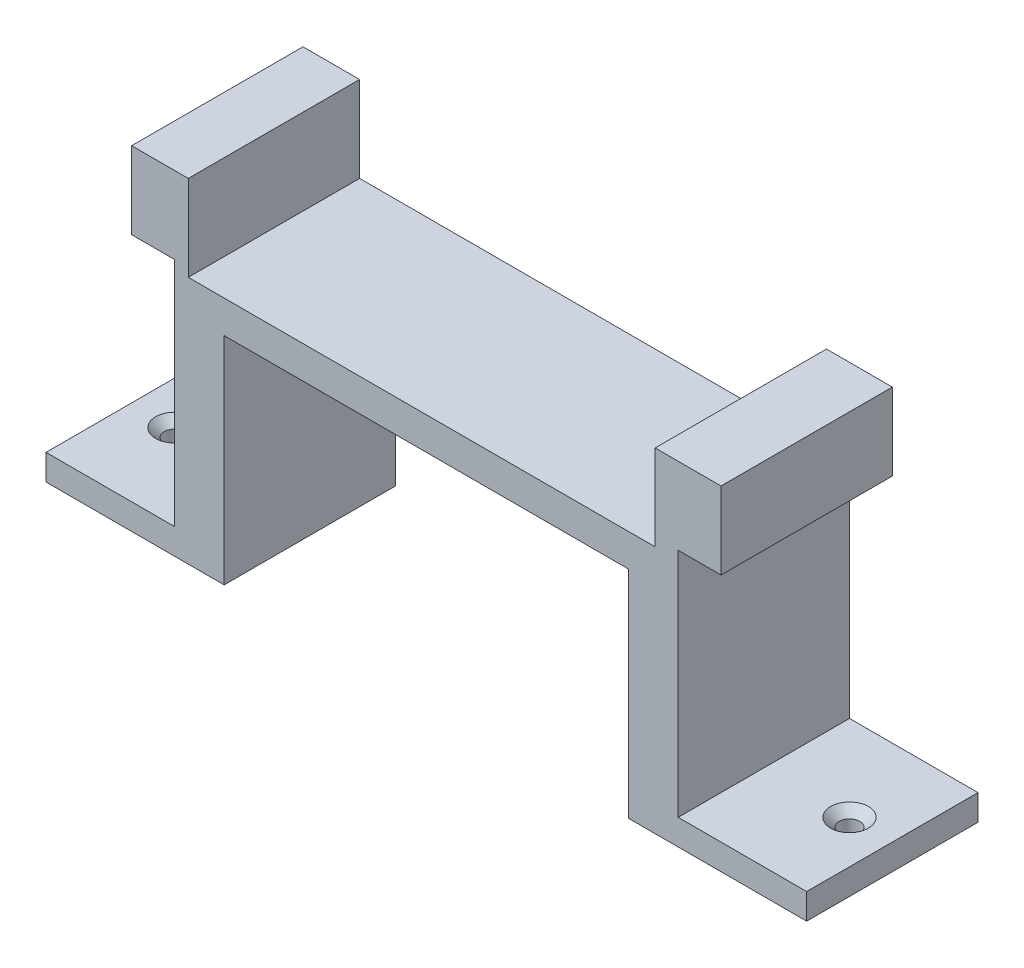
ISO-10303-21;
HEADER;
FILE_DESCRIPTION(('STEP AP214'),'2;1');
FILE_NAME('part.step','',(''),(''),'','','');
FILE_SCHEMA(('AUTOMOTIVE_DESIGN { 1 0 10303 214 1 1 1 1 }'));
ENDSEC;
DATA;
#1=APPLICATION_CONTEXT('core data for automotive mechanical design processes');
#2=APPLICATION_PROTOCOL_DEFINITION('international standard','automotive_design',2000,#1);
#3=PRODUCT_CONTEXT('',#1,'mechanical');
#4=PRODUCT('Part','Part','',(#3));
#5=PRODUCT_RELATED_PRODUCT_CATEGORY('part','',(#4));
#6=PRODUCT_DEFINITION_FORMATION('','',#4);
#7=PRODUCT_DEFINITION_CONTEXT('part definition',#1,'design');
#8=PRODUCT_DEFINITION('design','',#6,#7);
#9=PRODUCT_DEFINITION_SHAPE('','',#8);
#10=(LENGTH_UNIT() NAMED_UNIT(*) SI_UNIT(.MILLI.,.METRE.));
#11=(NAMED_UNIT(*) PLANE_ANGLE_UNIT() SI_UNIT($,.RADIAN.));
#12=(NAMED_UNIT(*) SI_UNIT($,.STERADIAN.) SOLID_ANGLE_UNIT());
#13=UNCERTAINTY_MEASURE_WITH_UNIT(LENGTH_MEASURE(1.E-05),#10,'distance_accuracy_value','');
#14=(GEOMETRIC_REPRESENTATION_CONTEXT(3) GLOBAL_UNCERTAINTY_ASSIGNED_CONTEXT((#13)) GLOBAL_UNIT_ASSIGNED_CONTEXT((#10,
#11,#12)) REPRESENTATION_CONTEXT('',''));
#15=CARTESIAN_POINT('',(0.,0.,0.));
#16=DIRECTION('',(0.,0.,1.));
#17=DIRECTION('',(1.,0.,0.));
#18=AXIS2_PLACEMENT_3D('',#15,#16,#17);
#19=CARTESIAN_POINT('',(29.4,-19.5,-30.));
#20=DIRECTION('',(-1.,0.,0.));
#21=DIRECTION('',(0.,0.,1.));
#22=AXIS2_PLACEMENT_3D('',#19,#20,#21);
#23=PLANE('',#22);
#24=DIRECTION('',(0.,0.,1.));
#25=VECTOR('',#24,1.);
#26=CARTESIAN_POINT('',(29.4,-16.5,20.));
#27=LINE('',#26,#25);
#28=CARTESIAN_POINT('',(29.4,-16.5,0.));
#29=VERTEX_POINT('',#28);
#30=CARTESIAN_POINT('',(29.4,-16.5,20.));
#31=VERTEX_POINT('',#30);
#32=EDGE_CURVE('E61',#29,#31,#27,.T.);
#33=ORIENTED_EDGE('',*,*,#32,.F.);
#34=DIRECTION('',(0.,-1.,0.));
#35=VECTOR('',#34,1.);
#36=CARTESIAN_POINT('',(29.4,0.,0.));
#37=LINE('',#36,#35);
#38=CARTESIAN_POINT('',(29.4,10.5,0.));
#39=VERTEX_POINT('',#38);
#40=EDGE_CURVE('E395',#39,#29,#37,.T.);
#41=ORIENTED_EDGE('',*,*,#40,.F.);
#42=DIRECTION('',(0.,0.,1.));
#43=VECTOR('',#42,1.);
#44=CARTESIAN_POINT('',(29.4,10.5,-30.));
#45=LINE('',#44,#43);
#46=CARTESIAN_POINT('',(29.4,10.5,20.));
#47=VERTEX_POINT('',#46);
#48=EDGE_CURVE('E258',#39,#47,#45,.T.);
#49=ORIENTED_EDGE('',*,*,#48,.T.);
#50=DIRECTION('',(0.,-1.,0.));
#51=VECTOR('',#50,1.);
#52=CARTESIAN_POINT('',(29.4,-19.5,20.));
#53=LINE('',#52,#51);
#54=EDGE_CURVE('E278',#47,#31,#53,.T.);
#55=ORIENTED_EDGE('',*,*,#54,.T.);
#56=EDGE_LOOP('',(#33,#41,#49,#55));
#57=FACE_BOUND('',#56,.T.);
#58=ADVANCED_FACE('F45',(#57),#23,.F.);
#59=CARTESIAN_POINT('',(-29.4,-19.5,-30.));
#60=DIRECTION('',(1.,0.,0.));
#61=DIRECTION('',(0.,0.,-1.));
#62=AXIS2_PLACEMENT_3D('',#59,#60,#61);
#63=PLANE('',#62);
#64=DIRECTION('',(0.,0.,-1.));
#65=VECTOR('',#64,1.);
#66=CARTESIAN_POINT('',(-29.4,-16.5,0.));
#67=LINE('',#66,#65);
#68=CARTESIAN_POINT('',(-29.4,-16.5,20.));
#69=VERTEX_POINT('',#68);
#70=CARTESIAN_POINT('',(-29.4,-16.5,0.));
#71=VERTEX_POINT('',#70);
#72=EDGE_CURVE('E69',#69,#71,#67,.T.);
#73=ORIENTED_EDGE('',*,*,#72,.F.);
#74=DIRECTION('',(0.,1.,0.));
#75=VECTOR('',#74,1.);
#76=CARTESIAN_POINT('',(-29.4,-19.5,20.));
#77=LINE('',#76,#75);
#78=CARTESIAN_POINT('',(-29.4,10.5,20.));
#79=VERTEX_POINT('',#78);
#80=EDGE_CURVE('E259',#69,#79,#77,.T.);
#81=ORIENTED_EDGE('',*,*,#80,.T.);
#82=DIRECTION('',(0.,0.,1.));
#83=VECTOR('',#82,1.);
#84=CARTESIAN_POINT('',(-29.4,10.5,-30.));
#85=LINE('',#84,#83);
#86=CARTESIAN_POINT('',(-29.4,10.5,0.));
#87=VERTEX_POINT('',#86);
#88=EDGE_CURVE('E266',#87,#79,#85,.T.);
#89=ORIENTED_EDGE('',*,*,#88,.F.);
#90=DIRECTION('',(0.,1.,0.));
#91=VECTOR('',#90,1.);
#92=CARTESIAN_POINT('',(-29.4,0.,0.));
#93=LINE('',#92,#91);
#94=EDGE_CURVE('E54',#71,#87,#93,.T.);
#95=ORIENTED_EDGE('',*,*,#94,.F.);
#96=EDGE_LOOP('',(#73,#81,#89,#95));
#97=FACE_BOUND('',#96,.T.);
#98=ADVANCED_FACE('F405',(#97),#63,.F.);
#99=CARTESIAN_POINT('',(-34.4,19.5,20.));
#100=DIRECTION('',(0.,-1.,0.));
#101=DIRECTION('',(0.,0.,-1.));
#102=AXIS2_PLACEMENT_3D('',#99,#100,#101);
#103=PLANE('',#102);
#104=DIRECTION('',(-1.,0.,0.));
#105=VECTOR('',#104,1.);
#106=CARTESIAN_POINT('',(-34.4,19.5,20.));
#107=LINE('',#106,#105);
#108=CARTESIAN_POINT('',(-27.79,19.5,20.));
#109=VERTEX_POINT('',#108);
#110=CARTESIAN_POINT('',(-34.4,19.5,20.));
#111=VERTEX_POINT('',#110);
#112=EDGE_CURVE('E336',#109,#111,#107,.T.);
#113=ORIENTED_EDGE('',*,*,#112,.F.);
#114=DIRECTION('',(0.,0.,1.));
#115=VECTOR('',#114,1.);
#116=CARTESIAN_POINT('',(-27.79,19.5,-30.));
#117=LINE('',#116,#115);
#118=CARTESIAN_POINT('',(-27.79,19.5,0.));
#119=VERTEX_POINT('',#118);
#120=EDGE_CURVE('E271',#119,#109,#117,.T.);
#121=ORIENTED_EDGE('',*,*,#120,.F.);
#122=DIRECTION('',(-1.,0.,0.));
#123=VECTOR('',#122,1.);
#124=CARTESIAN_POINT('',(-34.4,19.5,0.));
#125=LINE('',#124,#123);
#126=CARTESIAN_POINT('',(-34.4,19.5,0.));
#127=VERTEX_POINT('',#126);
#128=EDGE_CURVE('E349',#119,#127,#125,.T.);
#129=ORIENTED_EDGE('',*,*,#128,.T.);
#130=DIRECTION('',(0.,0.,-1.));
#131=VECTOR('',#130,1.);
#132=CARTESIAN_POINT('',(-34.4,19.5,20.));
#133=LINE('',#132,#131);
#134=EDGE_CURVE('E346',#111,#127,#133,.T.);
#135=ORIENTED_EDGE('',*,*,#134,.F.);
#136=EDGE_LOOP('',(#113,#121,#129,#135));
#137=FACE_BOUND('',#136,.T.);
#138=ADVANCED_FACE('F418',(#137),#103,.F.);
#139=CARTESIAN_POINT('',(-34.4,-19.5,20.));
#140=DIRECTION('',(0.,1.,0.));
#141=DIRECTION('',(0.,0.,1.));
#142=AXIS2_PLACEMENT_3D('',#139,#140,#141);
#143=PLANE('',#142);
#144=CARTESIAN_POINT('',(-39.4,-19.5,10.));
#145=DIRECTION('',(0.,1.,0.));
#146=DIRECTION('',(0.,0.,1.));
#147=AXIS2_PLACEMENT_3D('',#144,#145,#146);
#148=CIRCLE('',#147,1.19999999999999);
#149=CARTESIAN_POINT('',(-39.4,-19.5,11.2));
#150=VERTEX_POINT('',#149);
#151=EDGE_CURVE('E218',#150,#150,#148,.T.);
#152=ORIENTED_EDGE('',*,*,#151,.T.);
#153=EDGE_LOOP('',(#152));
#154=FACE_BOUND('',#153,.T.);
#155=DIRECTION('',(1.,0.,0.));
#156=VECTOR('',#155,1.);
#157=CARTESIAN_POINT('',(-34.4,-19.5,20.));
#158=LINE('',#157,#156);
#159=CARTESIAN_POINT('',(-44.4,-19.5,20.));
#160=VERTEX_POINT('',#159);
#161=CARTESIAN_POINT('',(-23.6,-19.5,20.));
#162=VERTEX_POINT('',#161);
#163=EDGE_CURVE('E198',#160,#162,#158,.T.);
#164=ORIENTED_EDGE('',*,*,#163,.F.);
#165=DIRECTION('',(0.,0.,1.));
#166=VECTOR('',#165,1.);
#167=CARTESIAN_POINT('',(-44.4,-19.5,0.));
#168=LINE('',#167,#166);
#169=CARTESIAN_POINT('',(-44.4,-19.5,0.));
#170=VERTEX_POINT('',#169);
#171=EDGE_CURVE('E238',#170,#160,#168,.T.);
#172=ORIENTED_EDGE('',*,*,#171,.F.);
#173=DIRECTION('',(1.,0.,0.));
#174=VECTOR('',#173,1.);
#175=CARTESIAN_POINT('',(-34.4,-19.5,0.));
#176=LINE('',#175,#174);
#177=CARTESIAN_POINT('',(-23.6,-19.5,0.));
#178=VERTEX_POINT('',#177);
#179=EDGE_CURVE('E337',#170,#178,#176,.T.);
#180=ORIENTED_EDGE('',*,*,#179,.T.);
#181=DIRECTION('',(0.,0.,1.));
#182=VECTOR('',#181,1.);
#183=CARTESIAN_POINT('',(-23.6,-19.5,-30.));
#184=LINE('',#183,#182);
#185=EDGE_CURVE('E297',#178,#162,#184,.T.);
#186=ORIENTED_EDGE('',*,*,#185,.T.);
#187=EDGE_LOOP('',(#164,#172,#180,#186));
#188=FACE_BOUND('',#187,.T.);
#189=ADVANCED_FACE('F479',(#154,#188),#143,.F.);
#190=CARTESIAN_POINT('',(34.4,19.5,20.));
#191=DIRECTION('',(-1.,0.,0.));
#192=DIRECTION('',(0.,-1.,0.));
#193=AXIS2_PLACEMENT_3D('',#190,#191,#192);
#194=PLANE('',#193);
#195=DIRECTION('',(0.,1.,0.));
#196=VECTOR('',#195,1.);
#197=CARTESIAN_POINT('',(34.4,19.5,20.));
#198=LINE('',#197,#196);
#199=CARTESIAN_POINT('',(34.4,10.5,20.));
#200=VERTEX_POINT('',#199);
#201=CARTESIAN_POINT('',(34.4,19.5,20.));
#202=VERTEX_POINT('',#201);
#203=EDGE_CURVE('E333',#200,#202,#198,.T.);
#204=ORIENTED_EDGE('',*,*,#203,.F.);
#205=DIRECTION('',(0.,0.,1.));
#206=VECTOR('',#205,1.);
#207=CARTESIAN_POINT('',(34.4,10.5,-30.));
#208=LINE('',#207,#206);
#209=CARTESIAN_POINT('',(34.4,10.5,0.));
#210=VERTEX_POINT('',#209);
#211=EDGE_CURVE('E275',#210,#200,#208,.T.);
#212=ORIENTED_EDGE('',*,*,#211,.F.);
#213=DIRECTION('',(0.,1.,0.));
#214=VECTOR('',#213,1.);
#215=CARTESIAN_POINT('',(34.4,19.5,0.));
#216=LINE('',#215,#214);
#217=CARTESIAN_POINT('',(34.4,19.5,0.));
#218=VERTEX_POINT('',#217);
#219=EDGE_CURVE('E301',#210,#218,#216,.T.);
#220=ORIENTED_EDGE('',*,*,#219,.T.);
#221=DIRECTION('',(0.,0.,-1.));
#222=VECTOR('',#221,1.);
#223=CARTESIAN_POINT('',(34.4,19.5,20.));
#224=LINE('',#223,#222);
#225=EDGE_CURVE('E363',#202,#218,#224,.T.);
#226=ORIENTED_EDGE('',*,*,#225,.F.);
#227=EDGE_LOOP('',(#204,#212,#220,#226));
#228=FACE_BOUND('',#227,.T.);
#229=ADVANCED_FACE('F47',(#228),#194,.F.);
#230=CARTESIAN_POINT('',(26.71,19.5,0.));
#231=VERTEX_POINT('',#230);
#232=EDGE_CURVE('E350',#218,#231,#125,.T.);
#233=ORIENTED_EDGE('',*,*,#232,.T.);
#234=DIRECTION('',(0.,0.,1.));
#235=VECTOR('',#234,1.);
#236=CARTESIAN_POINT('',(26.71,19.5,-30.));
#237=LINE('',#236,#235);
#238=CARTESIAN_POINT('',(26.71,19.5,20.));
#239=VERTEX_POINT('',#238);
#240=EDGE_CURVE('E318',#231,#239,#237,.T.);
#241=ORIENTED_EDGE('',*,*,#240,.T.);
#242=EDGE_CURVE('E338',#202,#239,#107,.T.);
#243=ORIENTED_EDGE('',*,*,#242,.F.);
#244=ORIENTED_EDGE('',*,*,#225,.T.);
#245=EDGE_LOOP('',(#233,#241,#243,#244));
#246=FACE_BOUND('',#245,.T.);
#247=ADVANCED_FACE('F434',(#246),#103,.F.);
#248=CARTESIAN_POINT('',(-34.4,19.5,20.));
#249=DIRECTION('',(1.,0.,0.));
#250=DIRECTION('',(0.,0.,-1.));
#251=AXIS2_PLACEMENT_3D('',#248,#249,#250);
#252=PLANE('',#251);
#253=DIRECTION('',(0.,-1.,0.));
#254=VECTOR('',#253,1.);
#255=CARTESIAN_POINT('',(-34.4,19.5,0.));
#256=LINE('',#255,#254);
#257=CARTESIAN_POINT('',(-34.4,10.5,0.));
#258=VERTEX_POINT('',#257);
#259=EDGE_CURVE('E354',#127,#258,#256,.T.);
#260=ORIENTED_EDGE('',*,*,#259,.T.);
#261=DIRECTION('',(0.,0.,1.));
#262=VECTOR('',#261,1.);
#263=CARTESIAN_POINT('',(-34.4,10.5,-30.));
#264=LINE('',#263,#262);
#265=CARTESIAN_POINT('',(-34.4,10.5,20.));
#266=VERTEX_POINT('',#265);
#267=EDGE_CURVE('E267',#258,#266,#264,.T.);
#268=ORIENTED_EDGE('',*,*,#267,.T.);
#269=DIRECTION('',(0.,-1.,0.));
#270=VECTOR('',#269,1.);
#271=CARTESIAN_POINT('',(-34.4,19.5,20.));
#272=LINE('',#271,#270);
#273=EDGE_CURVE('E199',#111,#266,#272,.T.);
#274=ORIENTED_EDGE('',*,*,#273,.F.);
#275=ORIENTED_EDGE('',*,*,#134,.T.);
#276=EDGE_LOOP('',(#260,#268,#274,#275));
#277=FACE_BOUND('',#276,.T.);
#278=ADVANCED_FACE('F410',(#277),#252,.F.);
#279=CARTESIAN_POINT('',(39.4,-19.5,10.));
#280=DIRECTION('',(0.,1.,0.));
#281=DIRECTION('',(0.,0.,1.));
#282=AXIS2_PLACEMENT_3D('',#279,#280,#281);
#283=CIRCLE('',#282,1.19999999999999);
#284=CARTESIAN_POINT('',(39.4,-19.5,11.2));
#285=VERTEX_POINT('',#284);
#286=EDGE_CURVE('E678',#285,#285,#283,.T.);
#287=ORIENTED_EDGE('',*,*,#286,.T.);
#288=EDGE_LOOP('',(#287));
#289=FACE_BOUND('',#288,.T.);
#290=CARTESIAN_POINT('',(23.6,-19.5,0.));
#291=VERTEX_POINT('',#290);
#292=CARTESIAN_POINT('',(44.4,-19.5,0.));
#293=VERTEX_POINT('',#292);
#294=EDGE_CURVE('E205',#291,#293,#176,.T.);
#295=ORIENTED_EDGE('',*,*,#294,.T.);
#296=DIRECTION('',(0.,0.,-1.));
#297=VECTOR('',#296,1.);
#298=CARTESIAN_POINT('',(44.4,-19.5,20.));
#299=LINE('',#298,#297);
#300=CARTESIAN_POINT('',(44.4,-19.5,20.));
#301=VERTEX_POINT('',#300);
#302=EDGE_CURVE('E202',#301,#293,#299,.T.);
#303=ORIENTED_EDGE('',*,*,#302,.F.);
#304=CARTESIAN_POINT('',(23.6,-19.5,20.));
#305=VERTEX_POINT('',#304);
#306=EDGE_CURVE('E185',#305,#301,#158,.T.);
#307=ORIENTED_EDGE('',*,*,#306,.F.);
#308=DIRECTION('',(0.,0.,1.));
#309=VECTOR('',#308,1.);
#310=CARTESIAN_POINT('',(23.6,-19.5,-30.));
#311=LINE('',#310,#309);
#312=EDGE_CURVE('E305',#291,#305,#311,.T.);
#313=ORIENTED_EDGE('',*,*,#312,.F.);
#314=EDGE_LOOP('',(#295,#303,#307,#313));
#315=FACE_BOUND('',#314,.T.);
#316=ADVANCED_FACE('F203',(#289,#315),#143,.F.);
#317=CARTESIAN_POINT('',(0.,0.,20.));
#318=DIRECTION('',(0.,0.,1.));
#319=DIRECTION('',(1.,0.,0.));
#320=AXIS2_PLACEMENT_3D('',#317,#318,#319);
#321=PLANE('',#320);
#322=DIRECTION('',(-1.,0.,0.));
#323=VECTOR('',#322,1.);
#324=CARTESIAN_POINT('',(-34.4,10.5,20.));
#325=LINE('',#324,#323);
#326=EDGE_CURVE('E262',#79,#266,#325,.T.);
#327=ORIENTED_EDGE('',*,*,#326,.F.);
#328=ORIENTED_EDGE('',*,*,#80,.F.);
#329=DIRECTION('',(1.,0.,0.));
#330=VECTOR('',#329,1.);
#331=CARTESIAN_POINT('',(-44.4,-16.5,20.));
#332=LINE('',#331,#330);
#333=CARTESIAN_POINT('',(-44.4,-16.5,20.));
#334=VERTEX_POINT('',#333);
#335=EDGE_CURVE('E254',#334,#69,#332,.T.);
#336=ORIENTED_EDGE('',*,*,#335,.F.);
#337=DIRECTION('',(0.,1.,0.));
#338=VECTOR('',#337,1.);
#339=CARTESIAN_POINT('',(-44.4,-19.5,20.));
#340=LINE('',#339,#338);
#341=EDGE_CURVE('E242',#160,#334,#340,.T.);
#342=ORIENTED_EDGE('',*,*,#341,.F.);
#343=ORIENTED_EDGE('',*,*,#163,.T.);
#344=DIRECTION('',(0.,-1.,0.));
#345=VECTOR('',#344,1.);
#346=CARTESIAN_POINT('',(-23.6,-19.5,20.));
#347=LINE('',#346,#345);
#348=CARTESIAN_POINT('',(-23.6,5.70000000000001,20.));
#349=VERTEX_POINT('',#348);
#350=EDGE_CURVE('E286',#349,#162,#347,.T.);
#351=ORIENTED_EDGE('',*,*,#350,.F.);
#352=DIRECTION('',(-1.,0.,0.));
#353=VECTOR('',#352,1.);
#354=CARTESIAN_POINT('',(-23.6,5.70000000000001,20.));
#355=LINE('',#354,#353);
#356=CARTESIAN_POINT('',(23.6,5.70000000000001,20.));
#357=VERTEX_POINT('',#356);
#358=EDGE_CURVE('E293',#357,#349,#355,.T.);
#359=ORIENTED_EDGE('',*,*,#358,.F.);
#360=DIRECTION('',(0.,1.,0.));
#361=VECTOR('',#360,1.);
#362=CARTESIAN_POINT('',(23.6,-19.5,20.));
#363=LINE('',#362,#361);
#364=EDGE_CURVE('E194',#305,#357,#363,.T.);
#365=ORIENTED_EDGE('',*,*,#364,.F.);
#366=ORIENTED_EDGE('',*,*,#306,.T.);
#367=DIRECTION('',(0.,-1.,0.));
#368=VECTOR('',#367,1.);
#369=CARTESIAN_POINT('',(44.4,-19.5,20.));
#370=LINE('',#369,#368);
#371=CARTESIAN_POINT('',(44.4,-16.5,20.));
#372=VERTEX_POINT('',#371);
#373=EDGE_CURVE('E191',#372,#301,#370,.T.);
#374=ORIENTED_EDGE('',*,*,#373,.F.);
#375=DIRECTION('',(-1.,0.,0.));
#376=VECTOR('',#375,1.);
#377=CARTESIAN_POINT('',(44.4,-16.5,20.));
#378=LINE('',#377,#376);
#379=EDGE_CURVE('E226',#372,#31,#378,.T.);
#380=ORIENTED_EDGE('',*,*,#379,.T.);
#381=ORIENTED_EDGE('',*,*,#54,.F.);
#382=DIRECTION('',(-1.,0.,0.));
#383=VECTOR('',#382,1.);
#384=CARTESIAN_POINT('',(34.4,10.5,20.));
#385=LINE('',#384,#383);
#386=EDGE_CURVE('E263',#200,#47,#385,.T.);
#387=ORIENTED_EDGE('',*,*,#386,.F.);
#388=ORIENTED_EDGE('',*,*,#203,.T.);
#389=ORIENTED_EDGE('',*,*,#242,.T.);
#390=DIRECTION('',(0.,1.,0.));
#391=VECTOR('',#390,1.);
#392=CARTESIAN_POINT('',(26.71,19.5,20.));
#393=LINE('',#392,#391);
#394=CARTESIAN_POINT('',(26.71,9.50000000000001,20.));
#395=VERTEX_POINT('',#394);
#396=EDGE_CURVE('E314',#395,#239,#393,.T.);
#397=ORIENTED_EDGE('',*,*,#396,.F.);
#398=DIRECTION('',(1.,0.,0.));
#399=VECTOR('',#398,1.);
#400=CARTESIAN_POINT('',(-27.79,9.50000000000001,20.));
#401=LINE('',#400,#399);
#402=CARTESIAN_POINT('',(-27.79,9.50000000000001,20.));
#403=VERTEX_POINT('',#402);
#404=EDGE_CURVE('E326',#403,#395,#401,.T.);
#405=ORIENTED_EDGE('',*,*,#404,.F.);
#406=DIRECTION('',(0.,-1.,0.));
#407=VECTOR('',#406,1.);
#408=CARTESIAN_POINT('',(-27.79,19.5,20.));
#409=LINE('',#408,#407);
#410=EDGE_CURVE('E290',#109,#403,#409,.T.);
#411=ORIENTED_EDGE('',*,*,#410,.F.);
#412=ORIENTED_EDGE('',*,*,#112,.T.);
#413=ORIENTED_EDGE('',*,*,#273,.T.);
#414=EDGE_LOOP('',(#327,#328,#336,#342,#343,#351,#359,#365,#366,#374,#380,#381,#387,#388,#389,
#397,#405,#411,#412,#413));
#415=FACE_BOUND('',#414,.T.);
#416=ADVANCED_FACE('F188',(#415),#321,.T.);
#417=CARTESIAN_POINT('',(0.,0.,0.));
#418=DIRECTION('',(0.,0.,1.));
#419=DIRECTION('',(1.,0.,0.));
#420=AXIS2_PLACEMENT_3D('',#417,#418,#419);
#421=PLANE('',#420);
#422=ORIENTED_EDGE('',*,*,#179,.F.);
#423=DIRECTION('',(0.,-1.,0.));
#424=VECTOR('',#423,1.);
#425=CARTESIAN_POINT('',(-44.4,-19.5,0.));
#426=LINE('',#425,#424);
#427=CARTESIAN_POINT('',(-44.4,-16.5,0.));
#428=VERTEX_POINT('',#427);
#429=EDGE_CURVE('E234',#428,#170,#426,.T.);
#430=ORIENTED_EDGE('',*,*,#429,.F.);
#431=DIRECTION('',(1.,0.,0.));
#432=VECTOR('',#431,1.);
#433=CARTESIAN_POINT('',(-44.4,-16.5,0.));
#434=LINE('',#433,#432);
#435=EDGE_CURVE('E248',#428,#71,#434,.T.);
#436=ORIENTED_EDGE('',*,*,#435,.T.);
#437=ORIENTED_EDGE('',*,*,#94,.T.);
#438=DIRECTION('',(-1.,0.,0.));
#439=VECTOR('',#438,1.);
#440=CARTESIAN_POINT('',(0.,10.5,0.));
#441=LINE('',#440,#439);
#442=EDGE_CURVE('E11',#87,#258,#441,.T.);
#443=ORIENTED_EDGE('',*,*,#442,.T.);
#444=ORIENTED_EDGE('',*,*,#259,.F.);
#445=ORIENTED_EDGE('',*,*,#128,.F.);
#446=DIRECTION('',(0.,-1.,0.));
#447=VECTOR('',#446,1.);
#448=CARTESIAN_POINT('',(-27.79,0.,0.));
#449=LINE('',#448,#447);
#450=CARTESIAN_POINT('',(-27.79,9.50000000000001,0.));
#451=VERTEX_POINT('',#450);
#452=EDGE_CURVE('E375',#119,#451,#449,.T.);
#453=ORIENTED_EDGE('',*,*,#452,.T.);
#454=DIRECTION('',(1.,0.,0.));
#455=VECTOR('',#454,1.);
#456=CARTESIAN_POINT('',(0.,9.50000000000001,0.));
#457=LINE('',#456,#455);
#458=CARTESIAN_POINT('',(26.71,9.50000000000001,0.));
#459=VERTEX_POINT('',#458);
#460=EDGE_CURVE('E367',#451,#459,#457,.T.);
#461=ORIENTED_EDGE('',*,*,#460,.T.);
#462=DIRECTION('',(0.,1.,0.));
#463=VECTOR('',#462,1.);
#464=CARTESIAN_POINT('',(26.71,0.,0.));
#465=LINE('',#464,#463);
#466=EDGE_CURVE('E371',#459,#231,#465,.T.);
#467=ORIENTED_EDGE('',*,*,#466,.T.);
#468=ORIENTED_EDGE('',*,*,#232,.F.);
#469=ORIENTED_EDGE('',*,*,#219,.F.);
#470=DIRECTION('',(-1.,0.,0.));
#471=VECTOR('',#470,1.);
#472=CARTESIAN_POINT('',(0.,10.5,0.));
#473=LINE('',#472,#471);
#474=EDGE_CURVE('E391',#210,#39,#473,.T.);
#475=ORIENTED_EDGE('',*,*,#474,.T.);
#476=ORIENTED_EDGE('',*,*,#40,.T.);
#477=DIRECTION('',(-1.,0.,0.));
#478=VECTOR('',#477,1.);
#479=CARTESIAN_POINT('',(44.4,-16.5,0.));
#480=LINE('',#479,#478);
#481=CARTESIAN_POINT('',(44.4,-16.5,0.));
#482=VERTEX_POINT('',#481);
#483=EDGE_CURVE('E230',#482,#29,#480,.T.);
#484=ORIENTED_EDGE('',*,*,#483,.F.);
#485=DIRECTION('',(0.,1.,0.));
#486=VECTOR('',#485,1.);
#487=CARTESIAN_POINT('',(44.4,-19.5,0.));
#488=LINE('',#487,#486);
#489=EDGE_CURVE('E209',#293,#482,#488,.T.);
#490=ORIENTED_EDGE('',*,*,#489,.F.);
#491=ORIENTED_EDGE('',*,*,#294,.F.);
#492=DIRECTION('',(0.,1.,0.));
#493=VECTOR('',#492,1.);
#494=CARTESIAN_POINT('',(23.6,0.,0.));
#495=LINE('',#494,#493);
#496=CARTESIAN_POINT('',(23.6,5.70000000000001,0.));
#497=VERTEX_POINT('',#496);
#498=EDGE_CURVE('E379',#291,#497,#495,.T.);
#499=ORIENTED_EDGE('',*,*,#498,.T.);
#500=DIRECTION('',(-1.,0.,0.));
#501=VECTOR('',#500,1.);
#502=CARTESIAN_POINT('',(0.,5.70000000000001,0.));
#503=LINE('',#502,#501);
#504=CARTESIAN_POINT('',(-23.6,5.70000000000001,0.));
#505=VERTEX_POINT('',#504);
#506=EDGE_CURVE('E383',#497,#505,#503,.T.);
#507=ORIENTED_EDGE('',*,*,#506,.T.);
#508=DIRECTION('',(0.,-1.,0.));
#509=VECTOR('',#508,1.);
#510=CARTESIAN_POINT('',(-23.6,0.,0.));
#511=LINE('',#510,#509);
#512=EDGE_CURVE('E387',#505,#178,#511,.T.);
#513=ORIENTED_EDGE('',*,*,#512,.T.);
#514=EDGE_LOOP('',(#422,#430,#436,#437,#443,#444,#445,#453,#461,#467,#468,#469,#475,#476,#484,
#490,#491,#499,#507,#513));
#515=FACE_BOUND('',#514,.T.);
#516=ADVANCED_FACE('F400',(#515),#421,.F.);
#517=CARTESIAN_POINT('',(-27.79,19.5,-30.));
#518=DIRECTION('',(-1.,0.,0.));
#519=DIRECTION('',(0.,-1.,0.));
#520=AXIS2_PLACEMENT_3D('',#517,#518,#519);
#521=PLANE('',#520);
#522=ORIENTED_EDGE('',*,*,#120,.T.);
#523=ORIENTED_EDGE('',*,*,#410,.T.);
#524=DIRECTION('',(0.,0.,1.));
#525=VECTOR('',#524,1.);
#526=CARTESIAN_POINT('',(-27.79,9.50000000000001,-30.));
#527=LINE('',#526,#525);
#528=EDGE_CURVE('E311',#451,#403,#527,.T.);
#529=ORIENTED_EDGE('',*,*,#528,.F.);
#530=ORIENTED_EDGE('',*,*,#452,.F.);
#531=EDGE_LOOP('',(#522,#523,#529,#530));
#532=FACE_BOUND('',#531,.T.);
#533=ADVANCED_FACE('F424',(#532),#521,.F.);
#534=CARTESIAN_POINT('',(26.71,19.5,-30.));
#535=DIRECTION('',(1.,0.,0.));
#536=DIRECTION('',(0.,0.,-1.));
#537=AXIS2_PLACEMENT_3D('',#534,#535,#536);
#538=PLANE('',#537);
#539=DIRECTION('',(0.,0.,1.));
#540=VECTOR('',#539,1.);
#541=CARTESIAN_POINT('',(26.71,9.50000000000001,-30.));
#542=LINE('',#541,#540);
#543=EDGE_CURVE('E315',#459,#395,#542,.T.);
#544=ORIENTED_EDGE('',*,*,#543,.T.);
#545=ORIENTED_EDGE('',*,*,#396,.T.);
#546=ORIENTED_EDGE('',*,*,#240,.F.);
#547=ORIENTED_EDGE('',*,*,#466,.F.);
#548=EDGE_LOOP('',(#544,#545,#546,#547));
#549=FACE_BOUND('',#548,.T.);
#550=ADVANCED_FACE('F430',(#549),#538,.F.);
#551=CARTESIAN_POINT('',(-27.79,9.50000000000001,-30.));
#552=DIRECTION('',(0.,-1.,0.));
#553=DIRECTION('',(0.,0.,-1.));
#554=AXIS2_PLACEMENT_3D('',#551,#552,#553);
#555=PLANE('',#554);
#556=ORIENTED_EDGE('',*,*,#528,.T.);
#557=ORIENTED_EDGE('',*,*,#404,.T.);
#558=ORIENTED_EDGE('',*,*,#543,.F.);
#559=ORIENTED_EDGE('',*,*,#460,.F.);
#560=EDGE_LOOP('',(#556,#557,#558,#559));
#561=FACE_BOUND('',#560,.T.);
#562=ADVANCED_FACE('F426',(#561),#555,.F.);
#563=CARTESIAN_POINT('',(-23.6,-19.5,-30.));
#564=DIRECTION('',(-1.,0.,0.));
#565=DIRECTION('',(0.,0.,1.));
#566=AXIS2_PLACEMENT_3D('',#563,#564,#565);
#567=PLANE('',#566);
#568=DIRECTION('',(0.,0.,1.));
#569=VECTOR('',#568,1.);
#570=CARTESIAN_POINT('',(-23.6,5.70000000000001,-30.));
#571=LINE('',#570,#569);
#572=EDGE_CURVE('E298',#505,#349,#571,.T.);
#573=ORIENTED_EDGE('',*,*,#572,.T.);
#574=ORIENTED_EDGE('',*,*,#350,.T.);
#575=ORIENTED_EDGE('',*,*,#185,.F.);
#576=ORIENTED_EDGE('',*,*,#512,.F.);
#577=EDGE_LOOP('',(#573,#574,#575,#576));
#578=FACE_BOUND('',#577,.T.);
#579=ADVANCED_FACE('F459',(#578),#567,.F.);
#580=CARTESIAN_POINT('',(-23.6,5.70000000000001,-30.));
#581=DIRECTION('',(0.,1.,0.));
#582=DIRECTION('',(0.,0.,1.));
#583=AXIS2_PLACEMENT_3D('',#580,#581,#582);
#584=PLANE('',#583);
#585=DIRECTION('',(0.,0.,1.));
#586=VECTOR('',#585,1.);
#587=CARTESIAN_POINT('',(23.6,5.70000000000001,-30.));
#588=LINE('',#587,#586);
#589=EDGE_CURVE('E302',#497,#357,#588,.T.);
#590=ORIENTED_EDGE('',*,*,#589,.T.);
#591=ORIENTED_EDGE('',*,*,#358,.T.);
#592=ORIENTED_EDGE('',*,*,#572,.F.);
#593=ORIENTED_EDGE('',*,*,#506,.F.);
#594=EDGE_LOOP('',(#590,#591,#592,#593));
#595=FACE_BOUND('',#594,.T.);
#596=ADVANCED_FACE('F455',(#595),#584,.F.);
#597=CARTESIAN_POINT('',(23.6,-19.5,-30.));
#598=DIRECTION('',(1.,0.,0.));
#599=DIRECTION('',(0.,1.,0.));
#600=AXIS2_PLACEMENT_3D('',#597,#598,#599);
#601=PLANE('',#600);
#602=ORIENTED_EDGE('',*,*,#312,.T.);
#603=ORIENTED_EDGE('',*,*,#364,.T.);
#604=ORIENTED_EDGE('',*,*,#589,.F.);
#605=ORIENTED_EDGE('',*,*,#498,.F.);
#606=EDGE_LOOP('',(#602,#603,#604,#605));
#607=FACE_BOUND('',#606,.T.);
#608=ADVANCED_FACE('F458',(#607),#601,.F.);
#609=CARTESIAN_POINT('',(34.4,10.5,-30.));
#610=DIRECTION('',(0.,1.,0.));
#611=DIRECTION('',(0.,0.,1.));
#612=AXIS2_PLACEMENT_3D('',#609,#610,#611);
#613=PLANE('',#612);
#614=ORIENTED_EDGE('',*,*,#211,.T.);
#615=ORIENTED_EDGE('',*,*,#386,.T.);
#616=ORIENTED_EDGE('',*,*,#48,.F.);
#617=ORIENTED_EDGE('',*,*,#474,.F.);
#618=EDGE_LOOP('',(#614,#615,#616,#617));
#619=FACE_BOUND('',#618,.T.);
#620=ADVANCED_FACE('F442',(#619),#613,.F.);
#621=CARTESIAN_POINT('',(-34.4,10.5,-30.));
#622=DIRECTION('',(0.,1.,0.));
#623=DIRECTION('',(0.,0.,1.));
#624=AXIS2_PLACEMENT_3D('',#621,#622,#623);
#625=PLANE('',#624);
#626=ORIENTED_EDGE('',*,*,#88,.T.);
#627=ORIENTED_EDGE('',*,*,#326,.T.);
#628=ORIENTED_EDGE('',*,*,#267,.F.);
#629=ORIENTED_EDGE('',*,*,#442,.F.);
#630=EDGE_LOOP('',(#626,#627,#628,#629));
#631=FACE_BOUND('',#630,.T.);
#632=ADVANCED_FACE('F407',(#631),#625,.F.);
#633=CARTESIAN_POINT('',(-44.4,-16.5,0.));
#634=DIRECTION('',(0.,-1.,0.));
#635=DIRECTION('',(0.,0.,-1.));
#636=AXIS2_PLACEMENT_3D('',#633,#634,#635);
#637=PLANE('',#636);
#638=CARTESIAN_POINT('',(-39.4,-16.5,10.));
#639=DIRECTION('',(0.,1.,0.));
#640=DIRECTION('',(0.,0.,1.));
#641=AXIS2_PLACEMENT_3D('',#638,#639,#640);
#642=CIRCLE('',#641,2.2);
#643=CARTESIAN_POINT('',(-39.4,-16.5,12.2));
#644=VERTEX_POINT('',#643);
#645=EDGE_CURVE('E684',#644,#644,#642,.T.);
#646=ORIENTED_EDGE('',*,*,#645,.F.);
#647=EDGE_LOOP('',(#646));
#648=FACE_BOUND('',#647,.T.);
#649=ORIENTED_EDGE('',*,*,#72,.T.);
#650=ORIENTED_EDGE('',*,*,#435,.F.);
#651=DIRECTION('',(0.,0.,-1.));
#652=VECTOR('',#651,1.);
#653=CARTESIAN_POINT('',(-44.4,-16.5,0.));
#654=LINE('',#653,#652);
#655=EDGE_CURVE('E245',#334,#428,#654,.T.);
#656=ORIENTED_EDGE('',*,*,#655,.F.);
#657=ORIENTED_EDGE('',*,*,#335,.T.);
#658=EDGE_LOOP('',(#649,#650,#656,#657));
#659=FACE_BOUND('',#658,.T.);
#660=ADVANCED_FACE('F506',(#648,#659),#637,.F.);
#661=CARTESIAN_POINT('',(-44.4,0.,0.));
#662=DIRECTION('',(1.,0.,0.));
#663=DIRECTION('',(0.,0.,-1.));
#664=AXIS2_PLACEMENT_3D('',#661,#662,#663);
#665=PLANE('',#664);
#666=ORIENTED_EDGE('',*,*,#429,.T.);
#667=ORIENTED_EDGE('',*,*,#171,.T.);
#668=ORIENTED_EDGE('',*,*,#341,.T.);
#669=ORIENTED_EDGE('',*,*,#655,.T.);
#670=EDGE_LOOP('',(#666,#667,#668,#669));
#671=FACE_BOUND('',#670,.T.);
#672=ADVANCED_FACE('F502',(#671),#665,.F.);
#673=CARTESIAN_POINT('',(44.4,-16.5,20.));
#674=DIRECTION('',(0.,-1.,0.));
#675=DIRECTION('',(0.,0.,-1.));
#676=AXIS2_PLACEMENT_3D('',#673,#674,#675);
#677=PLANE('',#676);
#678=CARTESIAN_POINT('',(39.4,-16.5,10.));
#679=DIRECTION('',(0.,1.,0.));
#680=DIRECTION('',(0.,0.,1.));
#681=AXIS2_PLACEMENT_3D('',#678,#679,#680);
#682=CIRCLE('',#681,2.2);
#683=CARTESIAN_POINT('',(39.4,-16.5,12.2));
#684=VERTEX_POINT('',#683);
#685=EDGE_CURVE('E674',#684,#684,#682,.T.);
#686=ORIENTED_EDGE('',*,*,#685,.F.);
#687=EDGE_LOOP('',(#686));
#688=FACE_BOUND('',#687,.T.);
#689=ORIENTED_EDGE('',*,*,#32,.T.);
#690=ORIENTED_EDGE('',*,*,#379,.F.);
#691=DIRECTION('',(0.,0.,1.));
#692=VECTOR('',#691,1.);
#693=CARTESIAN_POINT('',(44.4,-16.5,20.));
#694=LINE('',#693,#692);
#695=EDGE_CURVE('E213',#482,#372,#694,.T.);
#696=ORIENTED_EDGE('',*,*,#695,.F.);
#697=ORIENTED_EDGE('',*,*,#483,.T.);
#698=EDGE_LOOP('',(#689,#690,#696,#697));
#699=FACE_BOUND('',#698,.T.);
#700=ADVANCED_FACE('F510',(#688,#699),#677,.F.);
#701=CARTESIAN_POINT('',(44.4,0.,0.));
#702=DIRECTION('',(-1.,0.,0.));
#703=DIRECTION('',(0.,0.,1.));
#704=AXIS2_PLACEMENT_3D('',#701,#702,#703);
#705=PLANE('',#704);
#706=ORIENTED_EDGE('',*,*,#373,.T.);
#707=ORIENTED_EDGE('',*,*,#302,.T.);
#708=ORIENTED_EDGE('',*,*,#489,.T.);
#709=ORIENTED_EDGE('',*,*,#695,.T.);
#710=EDGE_LOOP('',(#706,#707,#708,#709));
#711=FACE_BOUND('',#710,.T.);
#712=ADVANCED_FACE('F211',(#711),#705,.F.);
#713=CARTESIAN_POINT('',(-39.4,-16.5,10.));
#714=DIRECTION('',(0.,1.,0.));
#715=DIRECTION('',(0.,0.,1.));
#716=AXIS2_PLACEMENT_3D('',#713,#714,#715);
#717=CYLINDRICAL_SURFACE('',#716,1.19999999999999);
#718=ORIENTED_EDGE('',*,*,#151,.F.);
#719=EDGE_LOOP('',(#718));
#720=FACE_BOUND('',#719,.T.);
#721=CARTESIAN_POINT('',(-39.4,-17.5,10.));
#722=DIRECTION('',(0.,1.,0.));
#723=DIRECTION('',(0.,0.,1.));
#724=AXIS2_PLACEMENT_3D('',#721,#722,#723);
#725=CIRCLE('',#724,1.2);
#726=CARTESIAN_POINT('',(-39.4,-17.5,11.2));
#727=VERTEX_POINT('',#726);
#728=EDGE_CURVE('E687',#727,#727,#725,.T.);
#729=ORIENTED_EDGE('',*,*,#728,.T.);
#730=EDGE_LOOP('',(#729));
#731=FACE_BOUND('',#730,.T.);
#732=ADVANCED_FACE('F517',(#720,#731),#717,.F.);
#733=CARTESIAN_POINT('',(-39.4,-16.5,10.));
#734=DIRECTION('',(0.,1.,0.));
#735=DIRECTION('',(0.,0.,1.));
#736=AXIS2_PLACEMENT_3D('',#733,#734,#735);
#737=CONICAL_SURFACE('',#736,2.2,0.785398163397447);
#738=ORIENTED_EDGE('',*,*,#728,.F.);
#739=EDGE_LOOP('',(#738));
#740=FACE_BOUND('',#739,.T.);
#741=ORIENTED_EDGE('',*,*,#645,.T.);
#742=EDGE_LOOP('',(#741));
#743=FACE_BOUND('',#742,.T.);
#744=ADVANCED_FACE('F639',(#740,#743),#737,.F.);
#745=CARTESIAN_POINT('',(39.4,-16.5,10.));
#746=DIRECTION('',(0.,1.,0.));
#747=DIRECTION('',(0.,0.,1.));
#748=AXIS2_PLACEMENT_3D('',#745,#746,#747);
#749=CYLINDRICAL_SURFACE('',#748,1.19999999999999);
#750=ORIENTED_EDGE('',*,*,#286,.F.);
#751=EDGE_LOOP('',(#750));
#752=FACE_BOUND('',#751,.T.);
#753=CARTESIAN_POINT('',(39.4,-17.5,10.));
#754=DIRECTION('',(0.,1.,0.));
#755=DIRECTION('',(0.,0.,1.));
#756=AXIS2_PLACEMENT_3D('',#753,#754,#755);
#757=CIRCLE('',#756,1.19999999999999);
#758=CARTESIAN_POINT('',(39.4,-17.5,11.2));
#759=VERTEX_POINT('',#758);
#760=EDGE_CURVE('E672',#759,#759,#757,.T.);
#761=ORIENTED_EDGE('',*,*,#760,.T.);
#762=EDGE_LOOP('',(#761));
#763=FACE_BOUND('',#762,.T.);
#764=ADVANCED_FACE('F647',(#752,#763),#749,.F.);
#765=CARTESIAN_POINT('',(39.4,-16.5,10.));
#766=DIRECTION('',(0.,1.,0.));
#767=DIRECTION('',(0.,0.,1.));
#768=AXIS2_PLACEMENT_3D('',#765,#766,#767);
#769=CONICAL_SURFACE('',#768,2.2,0.785398163397453);
#770=ORIENTED_EDGE('',*,*,#760,.F.);
#771=EDGE_LOOP('',(#770));
#772=FACE_BOUND('',#771,.T.);
#773=ORIENTED_EDGE('',*,*,#685,.T.);
#774=EDGE_LOOP('',(#773));
#775=FACE_BOUND('',#774,.T.);
#776=ADVANCED_FACE('F656',(#772,#775),#769,.F.);
#777=CLOSED_SHELL('',(#58,#98,#138,#189,#229,#247,#278,#316,#416,#516,#533,#550,#562,#579,#596,
#608,#620,#632,#660,#672,#700,#712,#732,#744,#764,#776));
#778=MANIFOLD_SOLID_BREP('B2',#777);
#779=ADVANCED_BREP_SHAPE_REPRESENTATION('',(#18,#778),#14);
#780=SHAPE_DEFINITION_REPRESENTATION(#9,#779);
ENDSEC;
END-ISO-10303-21;
